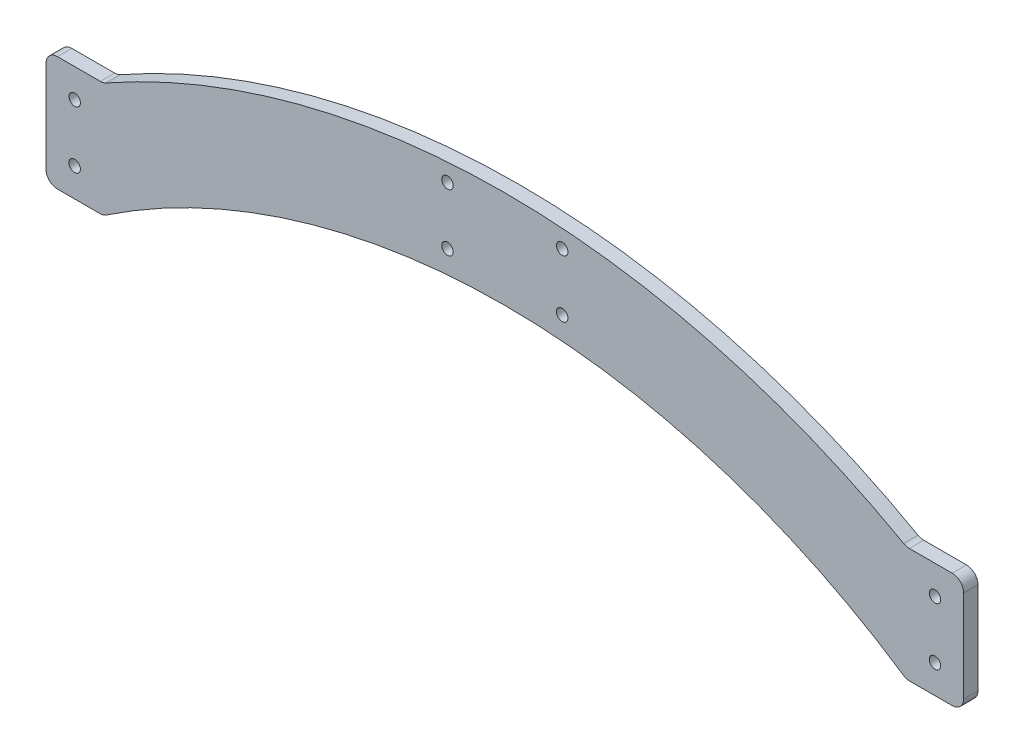
ISO-10303-21;
HEADER;
FILE_DESCRIPTION(('STEP AP214'),'2;1');
FILE_NAME('part.step','',(''),(''),'','','');
FILE_SCHEMA(('AUTOMOTIVE_DESIGN { 1 0 10303 214 1 1 1 1 }'));
ENDSEC;
DATA;
#1=APPLICATION_CONTEXT('core data for automotive mechanical design processes');
#2=APPLICATION_PROTOCOL_DEFINITION('international standard','automotive_design',2000,#1);
#3=PRODUCT_CONTEXT('',#1,'mechanical');
#4=PRODUCT('Part','Part','',(#3));
#5=PRODUCT_RELATED_PRODUCT_CATEGORY('part','',(#4));
#6=PRODUCT_DEFINITION_FORMATION('','',#4);
#7=PRODUCT_DEFINITION_CONTEXT('part definition',#1,'design');
#8=PRODUCT_DEFINITION('design','',#6,#7);
#9=PRODUCT_DEFINITION_SHAPE('','',#8);
#10=(LENGTH_UNIT() NAMED_UNIT(*) SI_UNIT(.MILLI.,.METRE.));
#11=(NAMED_UNIT(*) PLANE_ANGLE_UNIT() SI_UNIT($,.RADIAN.));
#12=(NAMED_UNIT(*) SI_UNIT($,.STERADIAN.) SOLID_ANGLE_UNIT());
#13=UNCERTAINTY_MEASURE_WITH_UNIT(LENGTH_MEASURE(1.E-05),#10,'distance_accuracy_value','');
#14=(GEOMETRIC_REPRESENTATION_CONTEXT(3) GLOBAL_UNCERTAINTY_ASSIGNED_CONTEXT((#13)) GLOBAL_UNIT_ASSIGNED_CONTEXT((#10,
#11,#12)) REPRESENTATION_CONTEXT('',''));
#15=CARTESIAN_POINT('',(0.,0.,0.));
#16=DIRECTION('',(0.,0.,1.));
#17=DIRECTION('',(1.,0.,0.));
#18=AXIS2_PLACEMENT_3D('',#15,#16,#17);
#19=CARTESIAN_POINT('',(0.,-207.12315177208,5.));
#20=DIRECTION('',(0.,0.,1.));
#21=DIRECTION('',(1.,0.,0.));
#22=AXIS2_PLACEMENT_3D('',#19,#20,#21);
#23=PLANE('',#22);
#24=CARTESIAN_POINT('',(150.,30.0000000000001,5.));
#25=DIRECTION('',(0.,0.,1.));
#26=DIRECTION('',(1.,0.,0.));
#27=AXIS2_PLACEMENT_3D('',#24,#25,#26);
#28=CIRCLE('',#27,2.);
#29=CARTESIAN_POINT('',(152.,30.0000000000001,5.));
#30=VERTEX_POINT('',#29);
#31=EDGE_CURVE('E394',#30,#30,#28,.T.);
#32=ORIENTED_EDGE('',*,*,#31,.F.);
#33=EDGE_LOOP('',(#32));
#34=FACE_BOUND('',#33,.T.);
#35=CARTESIAN_POINT('',(150.,9.99999999999995,5.));
#36=DIRECTION('',(0.,0.,1.));
#37=DIRECTION('',(1.,0.,0.));
#38=AXIS2_PLACEMENT_3D('',#35,#36,#37);
#39=CIRCLE('',#38,2.);
#40=CARTESIAN_POINT('',(152.,9.99999999999995,5.));
#41=VERTEX_POINT('',#40);
#42=EDGE_CURVE('E378',#41,#41,#39,.T.);
#43=ORIENTED_EDGE('',*,*,#42,.F.);
#44=EDGE_LOOP('',(#43));
#45=FACE_BOUND('',#44,.T.);
#46=CARTESIAN_POINT('',(-20.,50.,5.));
#47=DIRECTION('',(0.,0.,1.));
#48=DIRECTION('',(-1.,0.,0.));
#49=AXIS2_PLACEMENT_3D('',#46,#47,#48);
#50=CIRCLE('',#49,2.);
#51=CARTESIAN_POINT('',(-22.,50.,5.));
#52=VERTEX_POINT('',#51);
#53=EDGE_CURVE('E362',#52,#52,#50,.T.);
#54=ORIENTED_EDGE('',*,*,#53,.F.);
#55=EDGE_LOOP('',(#54));
#56=FACE_BOUND('',#55,.T.);
#57=CARTESIAN_POINT('',(20.,70.,5.));
#58=DIRECTION('',(0.,0.,1.));
#59=DIRECTION('',(1.,0.,0.));
#60=AXIS2_PLACEMENT_3D('',#57,#58,#59);
#61=CIRCLE('',#60,2.);
#62=CARTESIAN_POINT('',(22.,70.,5.));
#63=VERTEX_POINT('',#62);
#64=EDGE_CURVE('E324',#63,#63,#61,.T.);
#65=ORIENTED_EDGE('',*,*,#64,.F.);
#66=EDGE_LOOP('',(#65));
#67=FACE_BOUND('',#66,.T.);
#68=DIRECTION('',(-1.,0.,0.));
#69=VECTOR('',#68,1.);
#70=CARTESIAN_POINT('',(-140.,39.9999999999999,5.));
#71=LINE('',#70,#69);
#72=CARTESIAN_POINT('',(-141.050380637684,39.9999999999999,5.));
#73=VERTEX_POINT('',#72);
#74=CARTESIAN_POINT('',(-156.,40.,5.));
#75=VERTEX_POINT('',#74);
#76=EDGE_CURVE('E175',#73,#75,#71,.T.);
#77=ORIENTED_EDGE('',*,*,#76,.T.);
#78=CARTESIAN_POINT('',(-156.,36.,5.));
#79=DIRECTION('',(0.,0.,1.));
#80=DIRECTION('',(1.,0.,0.));
#81=AXIS2_PLACEMENT_3D('',#78,#79,#80);
#82=CIRCLE('',#81,4.);
#83=CARTESIAN_POINT('',(-160.,36.,5.));
#84=VERTEX_POINT('',#83);
#85=EDGE_CURVE('E246',#75,#84,#82,.T.);
#86=ORIENTED_EDGE('',*,*,#85,.T.);
#87=DIRECTION('',(0.,-1.,0.));
#88=VECTOR('',#87,1.);
#89=CARTESIAN_POINT('',(-160.,0.,5.));
#90=LINE('',#89,#88);
#91=CARTESIAN_POINT('',(-160.,4.00000000000003,5.));
#92=VERTEX_POINT('',#91);
#93=EDGE_CURVE('E309',#84,#92,#90,.T.);
#94=ORIENTED_EDGE('',*,*,#93,.T.);
#95=CARTESIAN_POINT('',(-156.,4.00000000000003,5.));
#96=DIRECTION('',(0.,0.,1.));
#97=DIRECTION('',(1.,0.,0.));
#98=AXIS2_PLACEMENT_3D('',#95,#96,#97);
#99=CIRCLE('',#98,4.);
#100=CARTESIAN_POINT('',(-156.,0.,5.));
#101=VERTEX_POINT('',#100);
#102=EDGE_CURVE('E62',#92,#101,#99,.T.);
#103=ORIENTED_EDGE('',*,*,#102,.T.);
#104=DIRECTION('',(1.,0.,0.));
#105=VECTOR('',#104,1.);
#106=CARTESIAN_POINT('',(-140.,0.,5.));
#107=LINE('',#106,#105);
#108=CARTESIAN_POINT('',(-141.219739363247,0.,5.));
#109=VERTEX_POINT('',#108);
#110=EDGE_CURVE('E201',#101,#109,#107,.T.);
#111=ORIENTED_EDGE('',*,*,#110,.T.);
#112=CARTESIAN_POINT('',(-141.219739363247,4.,5.));
#113=DIRECTION('',(0.,0.,1.));
#114=DIRECTION('',(1.,0.,0.));
#115=AXIS2_PLACEMENT_3D('',#112,#113,#114);
#116=CIRCLE('',#115,4.);
#117=CARTESIAN_POINT('',(-138.995806459889,0.675225956345227,5.));
#118=VERTEX_POINT('',#117);
#119=EDGE_CURVE('E235',#109,#118,#116,.T.);
#120=ORIENTED_EDGE('',*,*,#119,.T.);
#121=CARTESIAN_POINT('',(0.,-207.12315177208,5.));
#122=DIRECTION('',(0.,0.,-1.));
#123=DIRECTION('',(1.,0.,0.));
#124=AXIS2_PLACEMENT_3D('',#121,#122,#123);
#125=CIRCLE('',#124,250.);
#126=CARTESIAN_POINT('',(138.995806459889,0.675225956345227,5.));
#127=VERTEX_POINT('',#126);
#128=EDGE_CURVE('E199',#118,#127,#125,.T.);
#129=ORIENTED_EDGE('',*,*,#128,.T.);
#130=CARTESIAN_POINT('',(141.219739363247,4.00000000000003,5.));
#131=DIRECTION('',(0.,0.,1.));
#132=DIRECTION('',(1.,0.,0.));
#133=AXIS2_PLACEMENT_3D('',#130,#131,#132);
#134=CIRCLE('',#133,4.);
#135=CARTESIAN_POINT('',(141.219739363247,0.,5.));
#136=VERTEX_POINT('',#135);
#137=EDGE_CURVE('E232',#127,#136,#134,.T.);
#138=ORIENTED_EDGE('',*,*,#137,.T.);
#139=DIRECTION('',(1.,0.,0.));
#140=VECTOR('',#139,1.);
#141=CARTESIAN_POINT('',(140.,0.,5.));
#142=LINE('',#141,#140);
#143=CARTESIAN_POINT('',(156.,0.,5.));
#144=VERTEX_POINT('',#143);
#145=EDGE_CURVE('E343',#136,#144,#142,.T.);
#146=ORIENTED_EDGE('',*,*,#145,.T.);
#147=CARTESIAN_POINT('',(156.,4.00000000000003,5.));
#148=DIRECTION('',(0.,0.,1.));
#149=DIRECTION('',(1.,0.,0.));
#150=AXIS2_PLACEMENT_3D('',#147,#148,#149);
#151=CIRCLE('',#150,4.);
#152=CARTESIAN_POINT('',(160.,4.00000000000003,5.));
#153=VERTEX_POINT('',#152);
#154=EDGE_CURVE('E241',#144,#153,#151,.T.);
#155=ORIENTED_EDGE('',*,*,#154,.T.);
#156=DIRECTION('',(0.,1.,0.));
#157=VECTOR('',#156,1.);
#158=CARTESIAN_POINT('',(160.,0.,5.));
#159=LINE('',#158,#157);
#160=CARTESIAN_POINT('',(160.,36.,5.));
#161=VERTEX_POINT('',#160);
#162=EDGE_CURVE('E311',#153,#161,#159,.T.);
#163=ORIENTED_EDGE('',*,*,#162,.T.);
#164=CARTESIAN_POINT('',(156.,36.,5.));
#165=DIRECTION('',(0.,0.,1.));
#166=DIRECTION('',(1.,0.,0.));
#167=AXIS2_PLACEMENT_3D('',#164,#165,#166);
#168=CIRCLE('',#167,4.);
#169=CARTESIAN_POINT('',(156.,40.,5.));
#170=VERTEX_POINT('',#169);
#171=EDGE_CURVE('E238',#161,#170,#168,.T.);
#172=ORIENTED_EDGE('',*,*,#171,.T.);
#173=DIRECTION('',(-1.,0.,0.));
#174=VECTOR('',#173,1.);
#175=CARTESIAN_POINT('',(140.,40.,5.));
#176=LINE('',#175,#174);
#177=CARTESIAN_POINT('',(141.050380637684,40.,5.));
#178=VERTEX_POINT('',#177);
#179=EDGE_CURVE('E302',#170,#178,#176,.T.);
#180=ORIENTED_EDGE('',*,*,#179,.T.);
#181=CARTESIAN_POINT('',(141.050380637684,44.,5.));
#182=DIRECTION('',(0.,0.,1.));
#183=DIRECTION('',(1.,0.,0.));
#184=AXIS2_PLACEMENT_3D('',#181,#182,#183);
#185=CIRCLE('',#184,4.);
#186=CARTESIAN_POINT('',(139.091513441212,40.5124737554269,5.));
#187=VERTEX_POINT('',#186);
#188=EDGE_CURVE('E11',#178,#187,#185,.F.);
#189=ORIENTED_EDGE('',*,*,#188,.T.);
#190=CARTESIAN_POINT('',(0.,-207.12315177208,5.));
#191=DIRECTION('',(0.,0.,1.));
#192=DIRECTION('',(1.,0.,0.));
#193=AXIS2_PLACEMENT_3D('',#190,#191,#192);
#194=CIRCLE('',#193,284.024386526521);
#195=CARTESIAN_POINT('',(-139.091513441212,40.5124737554268,5.));
#196=VERTEX_POINT('',#195);
#197=EDGE_CURVE('E301',#187,#196,#194,.T.);
#198=ORIENTED_EDGE('',*,*,#197,.T.);
#199=CARTESIAN_POINT('',(-141.050380637684,43.9999999999999,5.));
#200=DIRECTION('',(0.,0.,1.));
#201=DIRECTION('',(1.,0.,0.));
#202=AXIS2_PLACEMENT_3D('',#199,#200,#201);
#203=CIRCLE('',#202,4.);
#204=EDGE_CURVE('E165',#196,#73,#203,.F.);
#205=ORIENTED_EDGE('',*,*,#204,.T.);
#206=EDGE_LOOP('',(#77,#86,#94,#103,#111,#120,#129,#138,#146,#155,#163,#172,#180,#189,#198,#205));
#207=FACE_BOUND('',#206,.T.);
#208=CARTESIAN_POINT('',(20.,50.,5.));
#209=DIRECTION('',(0.,0.,1.));
#210=DIRECTION('',(1.,0.,0.));
#211=AXIS2_PLACEMENT_3D('',#208,#209,#210);
#212=CIRCLE('',#211,2.);
#213=CARTESIAN_POINT('',(22.,50.,5.));
#214=VERTEX_POINT('',#213);
#215=EDGE_CURVE('E354',#214,#214,#212,.T.);
#216=ORIENTED_EDGE('',*,*,#215,.F.);
#217=EDGE_LOOP('',(#216));
#218=FACE_BOUND('',#217,.T.);
#219=CARTESIAN_POINT('',(-20.,70.,5.));
#220=DIRECTION('',(0.,0.,1.));
#221=DIRECTION('',(-1.,0.,0.));
#222=AXIS2_PLACEMENT_3D('',#219,#220,#221);
#223=CIRCLE('',#222,2.);
#224=CARTESIAN_POINT('',(-22.,70.,5.));
#225=VERTEX_POINT('',#224);
#226=EDGE_CURVE('E370',#225,#225,#223,.T.);
#227=ORIENTED_EDGE('',*,*,#226,.F.);
#228=EDGE_LOOP('',(#227));
#229=FACE_BOUND('',#228,.T.);
#230=CARTESIAN_POINT('',(-150.,9.99999999999995,5.));
#231=DIRECTION('',(0.,0.,1.));
#232=DIRECTION('',(-1.,0.,0.));
#233=AXIS2_PLACEMENT_3D('',#230,#231,#232);
#234=CIRCLE('',#233,2.);
#235=CARTESIAN_POINT('',(-152.,9.99999999999995,5.));
#236=VERTEX_POINT('',#235);
#237=EDGE_CURVE('E386',#236,#236,#234,.T.);
#238=ORIENTED_EDGE('',*,*,#237,.F.);
#239=EDGE_LOOP('',(#238));
#240=FACE_BOUND('',#239,.T.);
#241=CARTESIAN_POINT('',(-150.,30.0000000000001,5.));
#242=DIRECTION('',(0.,0.,1.));
#243=DIRECTION('',(-1.,0.,0.));
#244=AXIS2_PLACEMENT_3D('',#241,#242,#243);
#245=CIRCLE('',#244,2.);
#246=CARTESIAN_POINT('',(-152.,30.0000000000001,5.));
#247=VERTEX_POINT('',#246);
#248=EDGE_CURVE('E402',#247,#247,#245,.T.);
#249=ORIENTED_EDGE('',*,*,#248,.F.);
#250=EDGE_LOOP('',(#249));
#251=FACE_BOUND('',#250,.T.);
#252=ADVANCED_FACE('F39',(#34,#45,#56,#67,#207,#218,#229,#240,#251),#23,.T.);
#253=CARTESIAN_POINT('',(0.,-207.12315177208,0.));
#254=DIRECTION('',(0.,0.,1.));
#255=DIRECTION('',(1.,0.,0.));
#256=AXIS2_PLACEMENT_3D('',#253,#254,#255);
#257=PLANE('',#256);
#258=DIRECTION('',(0.,-1.,0.));
#259=VECTOR('',#258,1.);
#260=CARTESIAN_POINT('',(-160.,0.,0.));
#261=LINE('',#260,#259);
#262=CARTESIAN_POINT('',(-160.,36.,0.));
#263=VERTEX_POINT('',#262);
#264=CARTESIAN_POINT('',(-160.,4.00000000000003,0.));
#265=VERTEX_POINT('',#264);
#266=EDGE_CURVE('E185',#263,#265,#261,.T.);
#267=ORIENTED_EDGE('',*,*,#266,.F.);
#268=CARTESIAN_POINT('',(-156.,36.,0.));
#269=DIRECTION('',(0.,0.,1.));
#270=DIRECTION('',(1.,0.,0.));
#271=AXIS2_PLACEMENT_3D('',#268,#269,#270);
#272=CIRCLE('',#271,4.);
#273=CARTESIAN_POINT('',(-156.,40.,0.));
#274=VERTEX_POINT('',#273);
#275=EDGE_CURVE('E183',#263,#274,#272,.F.);
#276=ORIENTED_EDGE('',*,*,#275,.T.);
#277=DIRECTION('',(-1.,0.,0.));
#278=VECTOR('',#277,1.);
#279=CARTESIAN_POINT('',(-140.,39.9999999999999,0.));
#280=LINE('',#279,#278);
#281=CARTESIAN_POINT('',(-141.050380637684,39.9999999999999,0.));
#282=VERTEX_POINT('',#281);
#283=EDGE_CURVE('E172',#282,#274,#280,.T.);
#284=ORIENTED_EDGE('',*,*,#283,.F.);
#285=CARTESIAN_POINT('',(-141.050380637684,43.9999999999999,0.));
#286=DIRECTION('',(0.,0.,1.));
#287=DIRECTION('',(1.,0.,0.));
#288=AXIS2_PLACEMENT_3D('',#285,#286,#287);
#289=CIRCLE('',#288,4.);
#290=CARTESIAN_POINT('',(-139.091513441212,40.5124737554268,0.));
#291=VERTEX_POINT('',#290);
#292=EDGE_CURVE('E154',#282,#291,#289,.T.);
#293=ORIENTED_EDGE('',*,*,#292,.T.);
#294=CARTESIAN_POINT('',(0.,-207.12315177208,0.));
#295=DIRECTION('',(0.,0.,1.));
#296=DIRECTION('',(1.,0.,0.));
#297=AXIS2_PLACEMENT_3D('',#294,#295,#296);
#298=CIRCLE('',#297,284.024386526521);
#299=CARTESIAN_POINT('',(139.091513441212,40.5124737554269,0.));
#300=VERTEX_POINT('',#299);
#301=EDGE_CURVE('E186',#300,#291,#298,.T.);
#302=ORIENTED_EDGE('',*,*,#301,.F.);
#303=CARTESIAN_POINT('',(141.050380637684,44.,0.));
#304=DIRECTION('',(0.,0.,1.));
#305=DIRECTION('',(1.,0.,0.));
#306=AXIS2_PLACEMENT_3D('',#303,#304,#305);
#307=CIRCLE('',#306,4.);
#308=CARTESIAN_POINT('',(141.050380637684,40.,0.));
#309=VERTEX_POINT('',#308);
#310=EDGE_CURVE('E48',#300,#309,#307,.T.);
#311=ORIENTED_EDGE('',*,*,#310,.T.);
#312=DIRECTION('',(-1.,0.,0.));
#313=VECTOR('',#312,1.);
#314=CARTESIAN_POINT('',(140.,40.,0.));
#315=LINE('',#314,#313);
#316=CARTESIAN_POINT('',(156.,40.,0.));
#317=VERTEX_POINT('',#316);
#318=EDGE_CURVE('E193',#317,#309,#315,.T.);
#319=ORIENTED_EDGE('',*,*,#318,.F.);
#320=CARTESIAN_POINT('',(156.,36.,0.));
#321=DIRECTION('',(0.,0.,1.));
#322=DIRECTION('',(1.,0.,0.));
#323=AXIS2_PLACEMENT_3D('',#320,#321,#322);
#324=CIRCLE('',#323,4.);
#325=CARTESIAN_POINT('',(160.,36.,0.));
#326=VERTEX_POINT('',#325);
#327=EDGE_CURVE('E221',#317,#326,#324,.F.);
#328=ORIENTED_EDGE('',*,*,#327,.T.);
#329=DIRECTION('',(0.,1.,0.));
#330=VECTOR('',#329,1.);
#331=CARTESIAN_POINT('',(160.,0.,0.));
#332=LINE('',#331,#330);
#333=CARTESIAN_POINT('',(160.,4.00000000000003,0.));
#334=VERTEX_POINT('',#333);
#335=EDGE_CURVE('E295',#334,#326,#332,.T.);
#336=ORIENTED_EDGE('',*,*,#335,.F.);
#337=CARTESIAN_POINT('',(156.,4.00000000000003,0.));
#338=DIRECTION('',(0.,0.,1.));
#339=DIRECTION('',(1.,0.,0.));
#340=AXIS2_PLACEMENT_3D('',#337,#338,#339);
#341=CIRCLE('',#340,4.);
#342=CARTESIAN_POINT('',(156.,0.,0.));
#343=VERTEX_POINT('',#342);
#344=EDGE_CURVE('E224',#334,#343,#341,.F.);
#345=ORIENTED_EDGE('',*,*,#344,.T.);
#346=DIRECTION('',(1.,0.,0.));
#347=VECTOR('',#346,1.);
#348=CARTESIAN_POINT('',(140.,0.,0.));
#349=LINE('',#348,#347);
#350=CARTESIAN_POINT('',(141.219739363247,0.,0.));
#351=VERTEX_POINT('',#350);
#352=EDGE_CURVE('E323',#351,#343,#349,.T.);
#353=ORIENTED_EDGE('',*,*,#352,.F.);
#354=CARTESIAN_POINT('',(141.219739363247,4.00000000000003,0.));
#355=DIRECTION('',(0.,0.,1.));
#356=DIRECTION('',(1.,0.,0.));
#357=AXIS2_PLACEMENT_3D('',#354,#355,#356);
#358=CIRCLE('',#357,4.);
#359=CARTESIAN_POINT('',(138.995806459889,0.675225956345227,0.));
#360=VERTEX_POINT('',#359);
#361=EDGE_CURVE('E215',#351,#360,#358,.F.);
#362=ORIENTED_EDGE('',*,*,#361,.T.);
#363=CARTESIAN_POINT('',(0.,-207.12315177208,0.));
#364=DIRECTION('',(0.,0.,-1.));
#365=DIRECTION('',(1.,0.,0.));
#366=AXIS2_PLACEMENT_3D('',#363,#364,#365);
#367=CIRCLE('',#366,250.);
#368=CARTESIAN_POINT('',(-138.995806459889,0.675225956345227,0.));
#369=VERTEX_POINT('',#368);
#370=EDGE_CURVE('E319',#369,#360,#367,.T.);
#371=ORIENTED_EDGE('',*,*,#370,.F.);
#372=CARTESIAN_POINT('',(-141.219739363247,4.,0.));
#373=DIRECTION('',(0.,0.,1.));
#374=DIRECTION('',(1.,0.,0.));
#375=AXIS2_PLACEMENT_3D('',#372,#373,#374);
#376=CIRCLE('',#375,4.);
#377=CARTESIAN_POINT('',(-141.219739363247,0.,0.));
#378=VERTEX_POINT('',#377);
#379=EDGE_CURVE('E218',#369,#378,#376,.F.);
#380=ORIENTED_EDGE('',*,*,#379,.T.);
#381=DIRECTION('',(1.,0.,0.));
#382=VECTOR('',#381,1.);
#383=CARTESIAN_POINT('',(-140.,0.,0.));
#384=LINE('',#383,#382);
#385=CARTESIAN_POINT('',(-156.,0.,0.));
#386=VERTEX_POINT('',#385);
#387=EDGE_CURVE('E191',#386,#378,#384,.T.);
#388=ORIENTED_EDGE('',*,*,#387,.F.);
#389=CARTESIAN_POINT('',(-156.,4.00000000000003,0.));
#390=DIRECTION('',(0.,0.,1.));
#391=DIRECTION('',(1.,0.,0.));
#392=AXIS2_PLACEMENT_3D('',#389,#390,#391);
#393=CIRCLE('',#392,4.);
#394=EDGE_CURVE('E227',#386,#265,#393,.F.);
#395=ORIENTED_EDGE('',*,*,#394,.T.);
#396=EDGE_LOOP('',(#267,#276,#284,#293,#302,#311,#319,#328,#336,#345,#353,#362,#371,#380,#388,#395));
#397=FACE_BOUND('',#396,.T.);
#398=CARTESIAN_POINT('',(20.,70.,0.));
#399=DIRECTION('',(0.,0.,1.));
#400=DIRECTION('',(1.,0.,0.));
#401=AXIS2_PLACEMENT_3D('',#398,#399,#400);
#402=CIRCLE('',#401,2.);
#403=CARTESIAN_POINT('',(22.,70.,0.));
#404=VERTEX_POINT('',#403);
#405=EDGE_CURVE('E350',#404,#404,#402,.T.);
#406=ORIENTED_EDGE('',*,*,#405,.T.);
#407=EDGE_LOOP('',(#406));
#408=FACE_BOUND('',#407,.T.);
#409=CARTESIAN_POINT('',(20.,50.,0.));
#410=DIRECTION('',(0.,0.,1.));
#411=DIRECTION('',(1.,0.,0.));
#412=AXIS2_PLACEMENT_3D('',#409,#410,#411);
#413=CIRCLE('',#412,2.);
#414=CARTESIAN_POINT('',(22.,50.,0.));
#415=VERTEX_POINT('',#414);
#416=EDGE_CURVE('E358',#415,#415,#413,.T.);
#417=ORIENTED_EDGE('',*,*,#416,.T.);
#418=EDGE_LOOP('',(#417));
#419=FACE_BOUND('',#418,.T.);
#420=CARTESIAN_POINT('',(-20.,50.,0.));
#421=DIRECTION('',(0.,0.,1.));
#422=DIRECTION('',(-1.,0.,0.));
#423=AXIS2_PLACEMENT_3D('',#420,#421,#422);
#424=CIRCLE('',#423,2.);
#425=CARTESIAN_POINT('',(-22.,50.,0.));
#426=VERTEX_POINT('',#425);
#427=EDGE_CURVE('E366',#426,#426,#424,.T.);
#428=ORIENTED_EDGE('',*,*,#427,.T.);
#429=EDGE_LOOP('',(#428));
#430=FACE_BOUND('',#429,.T.);
#431=CARTESIAN_POINT('',(-20.,70.,0.));
#432=DIRECTION('',(0.,0.,1.));
#433=DIRECTION('',(-1.,0.,0.));
#434=AXIS2_PLACEMENT_3D('',#431,#432,#433);
#435=CIRCLE('',#434,2.);
#436=CARTESIAN_POINT('',(-22.,70.,0.));
#437=VERTEX_POINT('',#436);
#438=EDGE_CURVE('E374',#437,#437,#435,.T.);
#439=ORIENTED_EDGE('',*,*,#438,.T.);
#440=EDGE_LOOP('',(#439));
#441=FACE_BOUND('',#440,.T.);
#442=CARTESIAN_POINT('',(150.,9.99999999999995,0.));
#443=DIRECTION('',(0.,0.,1.));
#444=DIRECTION('',(1.,0.,0.));
#445=AXIS2_PLACEMENT_3D('',#442,#443,#444);
#446=CIRCLE('',#445,2.);
#447=CARTESIAN_POINT('',(152.,9.99999999999995,0.));
#448=VERTEX_POINT('',#447);
#449=EDGE_CURVE('E382',#448,#448,#446,.T.);
#450=ORIENTED_EDGE('',*,*,#449,.T.);
#451=EDGE_LOOP('',(#450));
#452=FACE_BOUND('',#451,.T.);
#453=CARTESIAN_POINT('',(-150.,9.99999999999995,0.));
#454=DIRECTION('',(0.,0.,1.));
#455=DIRECTION('',(-1.,0.,0.));
#456=AXIS2_PLACEMENT_3D('',#453,#454,#455);
#457=CIRCLE('',#456,2.);
#458=CARTESIAN_POINT('',(-152.,9.99999999999995,0.));
#459=VERTEX_POINT('',#458);
#460=EDGE_CURVE('E390',#459,#459,#457,.T.);
#461=ORIENTED_EDGE('',*,*,#460,.T.);
#462=EDGE_LOOP('',(#461));
#463=FACE_BOUND('',#462,.T.);
#464=CARTESIAN_POINT('',(150.,30.0000000000001,0.));
#465=DIRECTION('',(0.,0.,1.));
#466=DIRECTION('',(1.,0.,0.));
#467=AXIS2_PLACEMENT_3D('',#464,#465,#466);
#468=CIRCLE('',#467,2.);
#469=CARTESIAN_POINT('',(152.,30.0000000000001,0.));
#470=VERTEX_POINT('',#469);
#471=EDGE_CURVE('E398',#470,#470,#468,.T.);
#472=ORIENTED_EDGE('',*,*,#471,.T.);
#473=EDGE_LOOP('',(#472));
#474=FACE_BOUND('',#473,.T.);
#475=CARTESIAN_POINT('',(-150.,30.0000000000001,0.));
#476=DIRECTION('',(0.,0.,1.));
#477=DIRECTION('',(-1.,0.,0.));
#478=AXIS2_PLACEMENT_3D('',#475,#476,#477);
#479=CIRCLE('',#478,2.);
#480=CARTESIAN_POINT('',(-152.,30.0000000000001,0.));
#481=VERTEX_POINT('',#480);
#482=EDGE_CURVE('E406',#481,#481,#479,.T.);
#483=ORIENTED_EDGE('',*,*,#482,.T.);
#484=EDGE_LOOP('',(#483));
#485=FACE_BOUND('',#484,.T.);
#486=ADVANCED_FACE('F181',(#397,#408,#419,#430,#441,#452,#463,#474,#485),#257,.F.);
#487=CARTESIAN_POINT('',(0.,-207.12315177208,5.));
#488=DIRECTION('',(0.,0.,-1.));
#489=DIRECTION('',(-1.,0.,0.));
#490=AXIS2_PLACEMENT_3D('',#487,#488,#489);
#491=CYLINDRICAL_SURFACE('',#490,250.);
#492=ORIENTED_EDGE('',*,*,#128,.F.);
#493=DIRECTION('',(0.,0.,-1.));
#494=VECTOR('',#493,1.);
#495=CARTESIAN_POINT('',(-138.995806459889,0.675225956345227,5.));
#496=LINE('',#495,#494);
#497=EDGE_CURVE('E166',#118,#369,#496,.T.);
#498=ORIENTED_EDGE('',*,*,#497,.T.);
#499=ORIENTED_EDGE('',*,*,#370,.T.);
#500=DIRECTION('',(0.,0.,-1.));
#501=VECTOR('',#500,1.);
#502=CARTESIAN_POINT('',(138.995806459889,0.675225956345227,5.));
#503=LINE('',#502,#501);
#504=EDGE_CURVE('E276',#360,#127,#503,.F.);
#505=ORIENTED_EDGE('',*,*,#504,.T.);
#506=EDGE_LOOP('',(#492,#498,#499,#505));
#507=FACE_BOUND('',#506,.T.);
#508=ADVANCED_FACE('F423',(#507),#491,.F.);
#509=CARTESIAN_POINT('',(140.,0.,5.));
#510=DIRECTION('',(0.,1.,0.));
#511=DIRECTION('',(0.,0.,1.));
#512=AXIS2_PLACEMENT_3D('',#509,#510,#511);
#513=PLANE('',#512);
#514=ORIENTED_EDGE('',*,*,#352,.T.);
#515=DIRECTION('',(0.,0.,-1.));
#516=VECTOR('',#515,1.);
#517=CARTESIAN_POINT('',(156.,0.,5.));
#518=LINE('',#517,#516);
#519=EDGE_CURVE('E266',#343,#144,#518,.F.);
#520=ORIENTED_EDGE('',*,*,#519,.T.);
#521=ORIENTED_EDGE('',*,*,#145,.F.);
#522=DIRECTION('',(0.,0.,-1.));
#523=VECTOR('',#522,1.);
#524=CARTESIAN_POINT('',(141.219739363247,0.,5.));
#525=LINE('',#524,#523);
#526=EDGE_CURVE('E262',#136,#351,#525,.T.);
#527=ORIENTED_EDGE('',*,*,#526,.T.);
#528=EDGE_LOOP('',(#514,#520,#521,#527));
#529=FACE_BOUND('',#528,.T.);
#530=ADVANCED_FACE('F446',(#529),#513,.F.);
#531=CARTESIAN_POINT('',(160.,0.,5.));
#532=DIRECTION('',(-1.,0.,0.));
#533=DIRECTION('',(0.,0.,1.));
#534=AXIS2_PLACEMENT_3D('',#531,#532,#533);
#535=PLANE('',#534);
#536=ORIENTED_EDGE('',*,*,#162,.F.);
#537=DIRECTION('',(0.,0.,-1.));
#538=VECTOR('',#537,1.);
#539=CARTESIAN_POINT('',(160.,4.00000000000003,5.));
#540=LINE('',#539,#538);
#541=EDGE_CURVE('E258',#153,#334,#540,.T.);
#542=ORIENTED_EDGE('',*,*,#541,.T.);
#543=ORIENTED_EDGE('',*,*,#335,.T.);
#544=DIRECTION('',(0.,0.,-1.));
#545=VECTOR('',#544,1.);
#546=CARTESIAN_POINT('',(160.,36.,5.));
#547=LINE('',#546,#545);
#548=EDGE_CURVE('E255',#326,#161,#547,.F.);
#549=ORIENTED_EDGE('',*,*,#548,.T.);
#550=EDGE_LOOP('',(#536,#542,#543,#549));
#551=FACE_BOUND('',#550,.T.);
#552=ADVANCED_FACE('F334',(#551),#535,.F.);
#553=CARTESIAN_POINT('',(140.,40.,5.));
#554=DIRECTION('',(0.,-1.,0.));
#555=DIRECTION('',(1.,0.,0.));
#556=AXIS2_PLACEMENT_3D('',#553,#554,#555);
#557=PLANE('',#556);
#558=ORIENTED_EDGE('',*,*,#179,.F.);
#559=DIRECTION('',(0.,0.,-1.));
#560=VECTOR('',#559,1.);
#561=CARTESIAN_POINT('',(156.,40.,5.));
#562=LINE('',#561,#560);
#563=EDGE_CURVE('E272',#170,#317,#562,.T.);
#564=ORIENTED_EDGE('',*,*,#563,.T.);
#565=ORIENTED_EDGE('',*,*,#318,.T.);
#566=DIRECTION('',(0.,0.,1.));
#567=VECTOR('',#566,1.);
#568=CARTESIAN_POINT('',(141.050380637684,40.,5.));
#569=LINE('',#568,#567);
#570=EDGE_CURVE('E269',#309,#178,#569,.T.);
#571=ORIENTED_EDGE('',*,*,#570,.T.);
#572=EDGE_LOOP('',(#558,#564,#565,#571));
#573=FACE_BOUND('',#572,.T.);
#574=ADVANCED_FACE('F291',(#573),#557,.F.);
#575=CARTESIAN_POINT('',(0.,-207.12315177208,5.));
#576=DIRECTION('',(0.,0.,-1.));
#577=DIRECTION('',(-1.,0.,0.));
#578=AXIS2_PLACEMENT_3D('',#575,#576,#577);
#579=CYLINDRICAL_SURFACE('',#578,284.024386526521);
#580=ORIENTED_EDGE('',*,*,#301,.T.);
#581=DIRECTION('',(0.,0.,-1.));
#582=VECTOR('',#581,1.);
#583=CARTESIAN_POINT('',(-139.091513441212,40.5124737554268,5.));
#584=LINE('',#583,#582);
#585=EDGE_CURVE('E159',#291,#196,#584,.F.);
#586=ORIENTED_EDGE('',*,*,#585,.T.);
#587=ORIENTED_EDGE('',*,*,#197,.F.);
#588=DIRECTION('',(0.,0.,-1.));
#589=VECTOR('',#588,1.);
#590=CARTESIAN_POINT('',(139.091513441212,40.5124737554269,5.));
#591=LINE('',#590,#589);
#592=EDGE_CURVE('E177',#187,#300,#591,.T.);
#593=ORIENTED_EDGE('',*,*,#592,.T.);
#594=EDGE_LOOP('',(#580,#586,#587,#593));
#595=FACE_BOUND('',#594,.T.);
#596=ADVANCED_FACE('F304',(#595),#579,.T.);
#597=CARTESIAN_POINT('',(-140.,39.9999999999999,5.));
#598=DIRECTION('',(0.,-1.,0.));
#599=DIRECTION('',(1.,0.,0.));
#600=AXIS2_PLACEMENT_3D('',#597,#598,#599);
#601=PLANE('',#600);
#602=ORIENTED_EDGE('',*,*,#76,.F.);
#603=DIRECTION('',(0.,0.,1.));
#604=VECTOR('',#603,1.);
#605=CARTESIAN_POINT('',(-141.050380637684,39.9999999999999,0.));
#606=LINE('',#605,#604);
#607=EDGE_CURVE('E158',#73,#282,#606,.F.);
#608=ORIENTED_EDGE('',*,*,#607,.T.);
#609=ORIENTED_EDGE('',*,*,#283,.T.);
#610=DIRECTION('',(0.,0.,-1.));
#611=VECTOR('',#610,1.);
#612=CARTESIAN_POINT('',(-156.,40.,5.));
#613=LINE('',#612,#611);
#614=EDGE_CURVE('E178',#274,#75,#613,.F.);
#615=ORIENTED_EDGE('',*,*,#614,.T.);
#616=EDGE_LOOP('',(#602,#608,#609,#615));
#617=FACE_BOUND('',#616,.T.);
#618=ADVANCED_FACE('F171',(#617),#601,.F.);
#619=CARTESIAN_POINT('',(-160.,0.,5.));
#620=DIRECTION('',(1.,0.,0.));
#621=DIRECTION('',(0.,0.,-1.));
#622=AXIS2_PLACEMENT_3D('',#619,#620,#621);
#623=PLANE('',#622);
#624=ORIENTED_EDGE('',*,*,#93,.F.);
#625=DIRECTION('',(0.,0.,-1.));
#626=VECTOR('',#625,1.);
#627=CARTESIAN_POINT('',(-160.,36.,5.));
#628=LINE('',#627,#626);
#629=EDGE_CURVE('E211',#84,#263,#628,.T.);
#630=ORIENTED_EDGE('',*,*,#629,.T.);
#631=ORIENTED_EDGE('',*,*,#266,.T.);
#632=DIRECTION('',(0.,0.,-1.));
#633=VECTOR('',#632,1.);
#634=CARTESIAN_POINT('',(-160.,4.00000000000003,5.));
#635=LINE('',#634,#633);
#636=EDGE_CURVE('E208',#265,#92,#635,.F.);
#637=ORIENTED_EDGE('',*,*,#636,.T.);
#638=EDGE_LOOP('',(#624,#630,#631,#637));
#639=FACE_BOUND('',#638,.T.);
#640=ADVANCED_FACE('F434',(#639),#623,.F.);
#641=CARTESIAN_POINT('',(-140.,0.,5.));
#642=DIRECTION('',(0.,1.,0.));
#643=DIRECTION('',(-1.,0.,0.));
#644=AXIS2_PLACEMENT_3D('',#641,#642,#643);
#645=PLANE('',#644);
#646=ORIENTED_EDGE('',*,*,#110,.F.);
#647=DIRECTION('',(0.,0.,-1.));
#648=VECTOR('',#647,1.);
#649=CARTESIAN_POINT('',(-156.,0.,5.));
#650=LINE('',#649,#648);
#651=EDGE_CURVE('E251',#101,#386,#650,.T.);
#652=ORIENTED_EDGE('',*,*,#651,.T.);
#653=ORIENTED_EDGE('',*,*,#387,.T.);
#654=DIRECTION('',(0.,0.,-1.));
#655=VECTOR('',#654,1.);
#656=CARTESIAN_POINT('',(-141.219739363247,0.,5.));
#657=LINE('',#656,#655);
#658=EDGE_CURVE('E55',#378,#109,#657,.F.);
#659=ORIENTED_EDGE('',*,*,#658,.T.);
#660=EDGE_LOOP('',(#646,#652,#653,#659));
#661=FACE_BOUND('',#660,.T.);
#662=ADVANCED_FACE('F431',(#661),#645,.F.);
#663=CARTESIAN_POINT('',(20.,70.,5.));
#664=DIRECTION('',(0.,0.,-1.));
#665=DIRECTION('',(-1.,0.,0.));
#666=AXIS2_PLACEMENT_3D('',#663,#664,#665);
#667=CYLINDRICAL_SURFACE('',#666,2.);
#668=ORIENTED_EDGE('',*,*,#64,.T.);
#669=EDGE_LOOP('',(#668));
#670=FACE_BOUND('',#669,.T.);
#671=ORIENTED_EDGE('',*,*,#405,.F.);
#672=EDGE_LOOP('',(#671));
#673=FACE_BOUND('',#672,.T.);
#674=ADVANCED_FACE('F428',(#670,#673),#667,.F.);
#675=CARTESIAN_POINT('',(20.,50.,5.));
#676=DIRECTION('',(0.,0.,-1.));
#677=DIRECTION('',(-1.,0.,0.));
#678=AXIS2_PLACEMENT_3D('',#675,#676,#677);
#679=CYLINDRICAL_SURFACE('',#678,2.);
#680=ORIENTED_EDGE('',*,*,#215,.T.);
#681=EDGE_LOOP('',(#680));
#682=FACE_BOUND('',#681,.T.);
#683=ORIENTED_EDGE('',*,*,#416,.F.);
#684=EDGE_LOOP('',(#683));
#685=FACE_BOUND('',#684,.T.);
#686=ADVANCED_FACE('F653',(#682,#685),#679,.F.);
#687=CARTESIAN_POINT('',(-20.,50.,5.));
#688=DIRECTION('',(0.,0.,-1.));
#689=DIRECTION('',(-1.,0.,0.));
#690=AXIS2_PLACEMENT_3D('',#687,#688,#689);
#691=CYLINDRICAL_SURFACE('',#690,2.);
#692=ORIENTED_EDGE('',*,*,#53,.T.);
#693=EDGE_LOOP('',(#692));
#694=FACE_BOUND('',#693,.T.);
#695=ORIENTED_EDGE('',*,*,#427,.F.);
#696=EDGE_LOOP('',(#695));
#697=FACE_BOUND('',#696,.T.);
#698=ADVANCED_FACE('F643',(#694,#697),#691,.F.);
#699=CARTESIAN_POINT('',(-20.,70.,5.));
#700=DIRECTION('',(0.,0.,-1.));
#701=DIRECTION('',(-1.,0.,0.));
#702=AXIS2_PLACEMENT_3D('',#699,#700,#701);
#703=CYLINDRICAL_SURFACE('',#702,2.);
#704=ORIENTED_EDGE('',*,*,#226,.T.);
#705=EDGE_LOOP('',(#704));
#706=FACE_BOUND('',#705,.T.);
#707=ORIENTED_EDGE('',*,*,#438,.F.);
#708=EDGE_LOOP('',(#707));
#709=FACE_BOUND('',#708,.T.);
#710=ADVANCED_FACE('F633',(#706,#709),#703,.F.);
#711=CARTESIAN_POINT('',(150.,9.99999999999995,5.));
#712=DIRECTION('',(0.,0.,-1.));
#713=DIRECTION('',(-1.,0.,0.));
#714=AXIS2_PLACEMENT_3D('',#711,#712,#713);
#715=CYLINDRICAL_SURFACE('',#714,2.);
#716=ORIENTED_EDGE('',*,*,#42,.T.);
#717=EDGE_LOOP('',(#716));
#718=FACE_BOUND('',#717,.T.);
#719=ORIENTED_EDGE('',*,*,#449,.F.);
#720=EDGE_LOOP('',(#719));
#721=FACE_BOUND('',#720,.T.);
#722=ADVANCED_FACE('F623',(#718,#721),#715,.F.);
#723=CARTESIAN_POINT('',(-150.,9.99999999999995,5.));
#724=DIRECTION('',(0.,0.,-1.));
#725=DIRECTION('',(-1.,0.,0.));
#726=AXIS2_PLACEMENT_3D('',#723,#724,#725);
#727=CYLINDRICAL_SURFACE('',#726,2.);
#728=ORIENTED_EDGE('',*,*,#237,.T.);
#729=EDGE_LOOP('',(#728));
#730=FACE_BOUND('',#729,.T.);
#731=ORIENTED_EDGE('',*,*,#460,.F.);
#732=EDGE_LOOP('',(#731));
#733=FACE_BOUND('',#732,.T.);
#734=ADVANCED_FACE('F613',(#730,#733),#727,.F.);
#735=CARTESIAN_POINT('',(150.,30.0000000000001,5.));
#736=DIRECTION('',(0.,0.,-1.));
#737=DIRECTION('',(-1.,0.,0.));
#738=AXIS2_PLACEMENT_3D('',#735,#736,#737);
#739=CYLINDRICAL_SURFACE('',#738,2.);
#740=ORIENTED_EDGE('',*,*,#31,.T.);
#741=EDGE_LOOP('',(#740));
#742=FACE_BOUND('',#741,.T.);
#743=ORIENTED_EDGE('',*,*,#471,.F.);
#744=EDGE_LOOP('',(#743));
#745=FACE_BOUND('',#744,.T.);
#746=ADVANCED_FACE('F604',(#742,#745),#739,.F.);
#747=CARTESIAN_POINT('',(-150.,30.0000000000001,5.));
#748=DIRECTION('',(0.,0.,-1.));
#749=DIRECTION('',(-1.,0.,0.));
#750=AXIS2_PLACEMENT_3D('',#747,#748,#749);
#751=CYLINDRICAL_SURFACE('',#750,2.);
#752=ORIENTED_EDGE('',*,*,#248,.T.);
#753=EDGE_LOOP('',(#752));
#754=FACE_BOUND('',#753,.T.);
#755=ORIENTED_EDGE('',*,*,#482,.F.);
#756=EDGE_LOOP('',(#755));
#757=FACE_BOUND('',#756,.T.);
#758=ADVANCED_FACE('F414',(#754,#757),#751,.F.);
#759=CARTESIAN_POINT('',(-141.050380637684,43.9999999999999,5.));
#760=DIRECTION('',(0.,0.,-1.));
#761=DIRECTION('',(-1.,0.,0.));
#762=AXIS2_PLACEMENT_3D('',#759,#760,#761);
#763=CYLINDRICAL_SURFACE('',#762,4.);
#764=ORIENTED_EDGE('',*,*,#204,.F.);
#765=ORIENTED_EDGE('',*,*,#585,.F.);
#766=ORIENTED_EDGE('',*,*,#292,.F.);
#767=ORIENTED_EDGE('',*,*,#607,.F.);
#768=EDGE_LOOP('',(#764,#765,#766,#767));
#769=FACE_BOUND('',#768,.T.);
#770=ADVANCED_FACE('F157',(#769),#763,.F.);
#771=CARTESIAN_POINT('',(-156.,36.,5.));
#772=DIRECTION('',(0.,0.,-1.));
#773=DIRECTION('',(-1.,0.,0.));
#774=AXIS2_PLACEMENT_3D('',#771,#772,#773);
#775=CYLINDRICAL_SURFACE('',#774,4.);
#776=ORIENTED_EDGE('',*,*,#85,.F.);
#777=ORIENTED_EDGE('',*,*,#614,.F.);
#778=ORIENTED_EDGE('',*,*,#275,.F.);
#779=ORIENTED_EDGE('',*,*,#629,.F.);
#780=EDGE_LOOP('',(#776,#777,#778,#779));
#781=FACE_BOUND('',#780,.T.);
#782=ADVANCED_FACE('F455',(#781),#775,.T.);
#783=CARTESIAN_POINT('',(-156.,4.00000000000003,5.));
#784=DIRECTION('',(0.,0.,-1.));
#785=DIRECTION('',(-1.,0.,0.));
#786=AXIS2_PLACEMENT_3D('',#783,#784,#785);
#787=CYLINDRICAL_SURFACE('',#786,4.);
#788=ORIENTED_EDGE('',*,*,#102,.F.);
#789=ORIENTED_EDGE('',*,*,#636,.F.);
#790=ORIENTED_EDGE('',*,*,#394,.F.);
#791=ORIENTED_EDGE('',*,*,#651,.F.);
#792=EDGE_LOOP('',(#788,#789,#790,#791));
#793=FACE_BOUND('',#792,.T.);
#794=ADVANCED_FACE('F458',(#793),#787,.T.);
#795=CARTESIAN_POINT('',(156.,4.00000000000003,5.));
#796=DIRECTION('',(0.,0.,-1.));
#797=DIRECTION('',(-1.,0.,0.));
#798=AXIS2_PLACEMENT_3D('',#795,#796,#797);
#799=CYLINDRICAL_SURFACE('',#798,4.);
#800=ORIENTED_EDGE('',*,*,#154,.F.);
#801=ORIENTED_EDGE('',*,*,#519,.F.);
#802=ORIENTED_EDGE('',*,*,#344,.F.);
#803=ORIENTED_EDGE('',*,*,#541,.F.);
#804=EDGE_LOOP('',(#800,#801,#802,#803));
#805=FACE_BOUND('',#804,.T.);
#806=ADVANCED_FACE('F462',(#805),#799,.T.);
#807=CARTESIAN_POINT('',(156.,36.,5.));
#808=DIRECTION('',(0.,0.,-1.));
#809=DIRECTION('',(-1.,0.,0.));
#810=AXIS2_PLACEMENT_3D('',#807,#808,#809);
#811=CYLINDRICAL_SURFACE('',#810,4.);
#812=ORIENTED_EDGE('',*,*,#171,.F.);
#813=ORIENTED_EDGE('',*,*,#548,.F.);
#814=ORIENTED_EDGE('',*,*,#327,.F.);
#815=ORIENTED_EDGE('',*,*,#563,.F.);
#816=EDGE_LOOP('',(#812,#813,#814,#815));
#817=FACE_BOUND('',#816,.T.);
#818=ADVANCED_FACE('F339',(#817),#811,.T.);
#819=CARTESIAN_POINT('',(-141.219739363247,4.,5.));
#820=DIRECTION('',(0.,0.,-1.));
#821=DIRECTION('',(-1.,0.,0.));
#822=AXIS2_PLACEMENT_3D('',#819,#820,#821);
#823=CYLINDRICAL_SURFACE('',#822,4.);
#824=ORIENTED_EDGE('',*,*,#119,.F.);
#825=ORIENTED_EDGE('',*,*,#658,.F.);
#826=ORIENTED_EDGE('',*,*,#379,.F.);
#827=ORIENTED_EDGE('',*,*,#497,.F.);
#828=EDGE_LOOP('',(#824,#825,#826,#827));
#829=FACE_BOUND('',#828,.T.);
#830=ADVANCED_FACE('F469',(#829),#823,.T.);
#831=CARTESIAN_POINT('',(141.050380637684,44.,5.));
#832=DIRECTION('',(0.,0.,-1.));
#833=DIRECTION('',(-1.,0.,0.));
#834=AXIS2_PLACEMENT_3D('',#831,#832,#833);
#835=CYLINDRICAL_SURFACE('',#834,4.);
#836=ORIENTED_EDGE('',*,*,#188,.F.);
#837=ORIENTED_EDGE('',*,*,#570,.F.);
#838=ORIENTED_EDGE('',*,*,#310,.F.);
#839=ORIENTED_EDGE('',*,*,#592,.F.);
#840=EDGE_LOOP('',(#836,#837,#838,#839));
#841=FACE_BOUND('',#840,.T.);
#842=ADVANCED_FACE('F297',(#841),#835,.F.);
#843=CARTESIAN_POINT('',(141.219739363247,4.00000000000003,5.));
#844=DIRECTION('',(0.,0.,-1.));
#845=DIRECTION('',(-1.,0.,0.));
#846=AXIS2_PLACEMENT_3D('',#843,#844,#845);
#847=CYLINDRICAL_SURFACE('',#846,4.);
#848=ORIENTED_EDGE('',*,*,#137,.F.);
#849=ORIENTED_EDGE('',*,*,#504,.F.);
#850=ORIENTED_EDGE('',*,*,#361,.F.);
#851=ORIENTED_EDGE('',*,*,#526,.F.);
#852=EDGE_LOOP('',(#848,#849,#850,#851));
#853=FACE_BOUND('',#852,.T.);
#854=ADVANCED_FACE('F41',(#853),#847,.T.);
#855=CLOSED_SHELL('',(#252,#486,#508,#530,#552,#574,#596,#618,#640,#662,#674,#686,#698,#710,
#722,#734,#746,#758,#770,#782,#794,#806,#818,#830,#842,#854));
#856=MANIFOLD_SOLID_BREP('B2',#855);
#857=ADVANCED_BREP_SHAPE_REPRESENTATION('',(#18,#856),#14);
#858=SHAPE_DEFINITION_REPRESENTATION(#9,#857);
ENDSEC;
END-ISO-10303-21;
